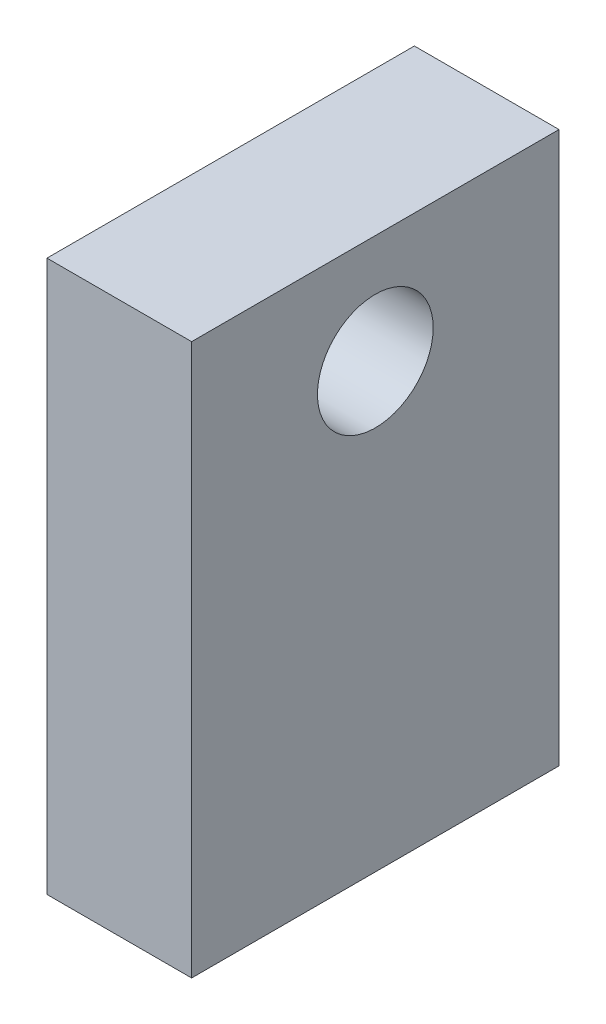
ISO-10303-21;
HEADER;
FILE_DESCRIPTION(('STEP AP214'),'2;1');
FILE_NAME('part.step','',(''),(''),'','','');
FILE_SCHEMA(('AUTOMOTIVE_DESIGN { 1 0 10303 214 1 1 1 1 }'));
ENDSEC;
DATA;
#1=APPLICATION_CONTEXT('core data for automotive mechanical design processes');
#2=APPLICATION_PROTOCOL_DEFINITION('international standard','automotive_design',2000,#1);
#3=PRODUCT_CONTEXT('',#1,'mechanical');
#4=PRODUCT('Part','Part','',(#3));
#5=PRODUCT_RELATED_PRODUCT_CATEGORY('part','',(#4));
#6=PRODUCT_DEFINITION_FORMATION('','',#4);
#7=PRODUCT_DEFINITION_CONTEXT('part definition',#1,'design');
#8=PRODUCT_DEFINITION('design','',#6,#7);
#9=PRODUCT_DEFINITION_SHAPE('','',#8);
#10=(LENGTH_UNIT() NAMED_UNIT(*) SI_UNIT(.MILLI.,.METRE.));
#11=(NAMED_UNIT(*) PLANE_ANGLE_UNIT() SI_UNIT($,.RADIAN.));
#12=(NAMED_UNIT(*) SI_UNIT($,.STERADIAN.) SOLID_ANGLE_UNIT());
#13=UNCERTAINTY_MEASURE_WITH_UNIT(LENGTH_MEASURE(1.E-05),#10,'distance_accuracy_value','');
#14=(GEOMETRIC_REPRESENTATION_CONTEXT(3) GLOBAL_UNCERTAINTY_ASSIGNED_CONTEXT((#13)) GLOBAL_UNIT_ASSIGNED_CONTEXT((#10,
#11,#12)) REPRESENTATION_CONTEXT('',''));
#15=CARTESIAN_POINT('',(0.,0.,0.));
#16=DIRECTION('',(0.,0.,1.));
#17=DIRECTION('',(1.,0.,0.));
#18=AXIS2_PLACEMENT_3D('',#15,#16,#17);
#19=CARTESIAN_POINT('',(5.,0.,-12.7));
#20=DIRECTION('',(0.,0.,1.));
#21=DIRECTION('',(1.,0.,0.));
#22=AXIS2_PLACEMENT_3D('',#19,#20,#21);
#23=PLANE('',#22);
#24=DIRECTION('',(0.,1.,0.));
#25=VECTOR('',#24,1.);
#26=CARTESIAN_POINT('',(0.,0.,-12.7));
#27=LINE('',#26,#25);
#28=CARTESIAN_POINT('',(0.,0.,-12.7));
#29=VERTEX_POINT('',#28);
#30=CARTESIAN_POINT('',(0.,19.05,-12.7));
#31=VERTEX_POINT('',#30);
#32=EDGE_CURVE('E101',#29,#31,#27,.T.);
#33=ORIENTED_EDGE('',*,*,#32,.T.);
#34=DIRECTION('',(-1.,0.,0.));
#35=VECTOR('',#34,1.);
#36=CARTESIAN_POINT('',(5.,19.05,-12.7));
#37=LINE('',#36,#35);
#38=CARTESIAN_POINT('',(5.,19.05,-12.7));
#39=VERTEX_POINT('',#38);
#40=EDGE_CURVE('E11',#39,#31,#37,.T.);
#41=ORIENTED_EDGE('',*,*,#40,.F.);
#42=DIRECTION('',(0.,1.,0.));
#43=VECTOR('',#42,1.);
#44=CARTESIAN_POINT('',(5.,0.,-12.7));
#45=LINE('',#44,#43);
#46=CARTESIAN_POINT('',(5.,0.,-12.7));
#47=VERTEX_POINT('',#46);
#48=EDGE_CURVE('E75',#47,#39,#45,.T.);
#49=ORIENTED_EDGE('',*,*,#48,.F.);
#50=DIRECTION('',(-1.,0.,0.));
#51=VECTOR('',#50,1.);
#52=CARTESIAN_POINT('',(5.,0.,-12.7));
#53=LINE('',#52,#51);
#54=EDGE_CURVE('E94',#47,#29,#53,.T.);
#55=ORIENTED_EDGE('',*,*,#54,.T.);
#56=EDGE_LOOP('',(#33,#41,#49,#55));
#57=FACE_BOUND('',#56,.T.);
#58=ADVANCED_FACE('F35',(#57),#23,.F.);
#59=CARTESIAN_POINT('',(5.,19.05,0.));
#60=DIRECTION('',(0.,1.,0.));
#61=DIRECTION('',(0.,0.,1.));
#62=AXIS2_PLACEMENT_3D('',#59,#60,#61);
#63=PLANE('',#62);
#64=DIRECTION('',(0.,0.,-1.));
#65=VECTOR('',#64,1.);
#66=CARTESIAN_POINT('',(0.,19.05,0.));
#67=LINE('',#66,#65);
#68=CARTESIAN_POINT('',(0.,19.05,0.));
#69=VERTEX_POINT('',#68);
#70=EDGE_CURVE('E84',#69,#31,#67,.T.);
#71=ORIENTED_EDGE('',*,*,#70,.F.);
#72=DIRECTION('',(-1.,0.,0.));
#73=VECTOR('',#72,1.);
#74=CARTESIAN_POINT('',(5.,19.05,0.));
#75=LINE('',#74,#73);
#76=CARTESIAN_POINT('',(5.,19.05,0.));
#77=VERTEX_POINT('',#76);
#78=EDGE_CURVE('E44',#77,#69,#75,.T.);
#79=ORIENTED_EDGE('',*,*,#78,.F.);
#80=DIRECTION('',(0.,0.,-1.));
#81=VECTOR('',#80,1.);
#82=CARTESIAN_POINT('',(5.,19.05,0.));
#83=LINE('',#82,#81);
#84=EDGE_CURVE('E82',#77,#39,#83,.T.);
#85=ORIENTED_EDGE('',*,*,#84,.T.);
#86=ORIENTED_EDGE('',*,*,#40,.T.);
#87=EDGE_LOOP('',(#71,#79,#85,#86));
#88=FACE_BOUND('',#87,.T.);
#89=ADVANCED_FACE('F81',(#88),#63,.T.);
#90=CARTESIAN_POINT('',(5.,0.,0.));
#91=DIRECTION('',(0.,0.,1.));
#92=DIRECTION('',(1.,0.,0.));
#93=AXIS2_PLACEMENT_3D('',#90,#91,#92);
#94=PLANE('',#93);
#95=DIRECTION('',(0.,1.,0.));
#96=VECTOR('',#95,1.);
#97=CARTESIAN_POINT('',(0.,0.,0.));
#98=LINE('',#97,#96);
#99=CARTESIAN_POINT('',(0.,0.,0.));
#100=VERTEX_POINT('',#99);
#101=EDGE_CURVE('E105',#100,#69,#98,.T.);
#102=ORIENTED_EDGE('',*,*,#101,.F.);
#103=DIRECTION('',(-1.,0.,0.));
#104=VECTOR('',#103,1.);
#105=CARTESIAN_POINT('',(5.,0.,0.));
#106=LINE('',#105,#104);
#107=CARTESIAN_POINT('',(5.,0.,0.));
#108=VERTEX_POINT('',#107);
#109=EDGE_CURVE('E67',#108,#100,#106,.T.);
#110=ORIENTED_EDGE('',*,*,#109,.F.);
#111=DIRECTION('',(0.,1.,0.));
#112=VECTOR('',#111,1.);
#113=CARTESIAN_POINT('',(5.,0.,0.));
#114=LINE('',#113,#112);
#115=EDGE_CURVE('E90',#108,#77,#114,.T.);
#116=ORIENTED_EDGE('',*,*,#115,.T.);
#117=ORIENTED_EDGE('',*,*,#78,.T.);
#118=EDGE_LOOP('',(#102,#110,#116,#117));
#119=FACE_BOUND('',#118,.T.);
#120=ADVANCED_FACE('F92',(#119),#94,.T.);
#121=CARTESIAN_POINT('',(5.,15.2928705353759,-6.35));
#122=DIRECTION('',(-1.,0.,0.));
#123=DIRECTION('',(0.,0.,1.));
#124=AXIS2_PLACEMENT_3D('',#121,#122,#123);
#125=CYLINDRICAL_SURFACE('',#124,2.);
#126=CARTESIAN_POINT('',(5.,15.2928705353759,-6.35));
#127=DIRECTION('',(1.,0.,0.));
#128=DIRECTION('',(0.,0.,-1.));
#129=AXIS2_PLACEMENT_3D('',#126,#127,#128);
#130=CIRCLE('',#129,2.);
#131=CARTESIAN_POINT('',(5.,15.2928705353759,-8.35));
#132=VERTEX_POINT('',#131);
#133=EDGE_CURVE('E108',#132,#132,#130,.T.);
#134=ORIENTED_EDGE('',*,*,#133,.T.);
#135=EDGE_LOOP('',(#134));
#136=FACE_BOUND('',#135,.T.);
#137=CARTESIAN_POINT('',(0.,15.2928705353759,-6.35));
#138=DIRECTION('',(1.,0.,0.));
#139=DIRECTION('',(0.,0.,-1.));
#140=AXIS2_PLACEMENT_3D('',#137,#138,#139);
#141=CIRCLE('',#140,2.);
#142=CARTESIAN_POINT('',(0.,15.2928705353759,-8.35));
#143=VERTEX_POINT('',#142);
#144=EDGE_CURVE('E98',#143,#143,#141,.T.);
#145=ORIENTED_EDGE('',*,*,#144,.F.);
#146=EDGE_LOOP('',(#145));
#147=FACE_BOUND('',#146,.T.);
#148=ADVANCED_FACE('F37',(#136,#147),#125,.F.);
#149=CARTESIAN_POINT('',(5.,0.,0.));
#150=DIRECTION('',(0.,1.,0.));
#151=DIRECTION('',(0.,0.,1.));
#152=AXIS2_PLACEMENT_3D('',#149,#150,#151);
#153=PLANE('',#152);
#154=DIRECTION('',(0.,0.,-1.));
#155=VECTOR('',#154,1.);
#156=CARTESIAN_POINT('',(0.,0.,0.));
#157=LINE('',#156,#155);
#158=EDGE_CURVE('E70',#100,#29,#157,.T.);
#159=ORIENTED_EDGE('',*,*,#158,.T.);
#160=ORIENTED_EDGE('',*,*,#54,.F.);
#161=DIRECTION('',(0.,0.,-1.));
#162=VECTOR('',#161,1.);
#163=CARTESIAN_POINT('',(5.,0.,0.));
#164=LINE('',#163,#162);
#165=EDGE_CURVE('E52',#108,#47,#164,.T.);
#166=ORIENTED_EDGE('',*,*,#165,.F.);
#167=ORIENTED_EDGE('',*,*,#109,.T.);
#168=EDGE_LOOP('',(#159,#160,#166,#167));
#169=FACE_BOUND('',#168,.T.);
#170=ADVANCED_FACE('F120',(#169),#153,.F.);
#171=CARTESIAN_POINT('',(5.,0.,0.));
#172=DIRECTION('',(1.,0.,0.));
#173=DIRECTION('',(0.,0.,-1.));
#174=AXIS2_PLACEMENT_3D('',#171,#172,#173);
#175=PLANE('',#174);
#176=ORIENTED_EDGE('',*,*,#133,.F.);
#177=EDGE_LOOP('',(#176));
#178=FACE_BOUND('',#177,.T.);
#179=ORIENTED_EDGE('',*,*,#48,.T.);
#180=ORIENTED_EDGE('',*,*,#84,.F.);
#181=ORIENTED_EDGE('',*,*,#115,.F.);
#182=ORIENTED_EDGE('',*,*,#165,.T.);
#183=EDGE_LOOP('',(#179,#180,#181,#182));
#184=FACE_BOUND('',#183,.T.);
#185=ADVANCED_FACE('F89',(#178,#184),#175,.T.);
#186=CARTESIAN_POINT('',(0.,0.,0.));
#187=DIRECTION('',(1.,0.,0.));
#188=DIRECTION('',(0.,0.,-1.));
#189=AXIS2_PLACEMENT_3D('',#186,#187,#188);
#190=PLANE('',#189);
#191=ORIENTED_EDGE('',*,*,#144,.T.);
#192=EDGE_LOOP('',(#191));
#193=FACE_BOUND('',#192,.T.);
#194=ORIENTED_EDGE('',*,*,#32,.F.);
#195=ORIENTED_EDGE('',*,*,#158,.F.);
#196=ORIENTED_EDGE('',*,*,#101,.T.);
#197=ORIENTED_EDGE('',*,*,#70,.T.);
#198=EDGE_LOOP('',(#194,#195,#196,#197));
#199=FACE_BOUND('',#198,.T.);
#200=ADVANCED_FACE('F113',(#193,#199),#190,.F.);
#201=CLOSED_SHELL('',(#58,#89,#120,#148,#170,#185,#200));
#202=MANIFOLD_SOLID_BREP('B2',#201);
#203=ADVANCED_BREP_SHAPE_REPRESENTATION('',(#18,#202),#14);
#204=SHAPE_DEFINITION_REPRESENTATION(#9,#203);
ENDSEC;
END-ISO-10303-21;
